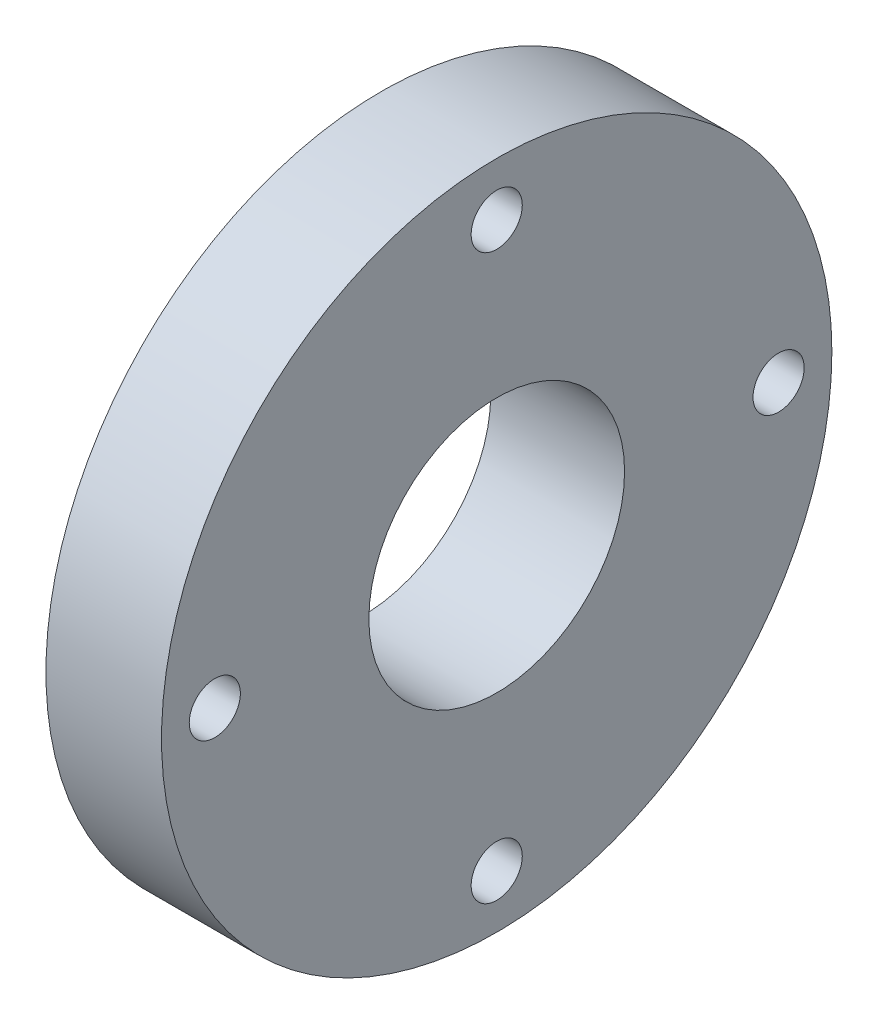
ISO-10303-21;
HEADER;
FILE_DESCRIPTION(('STEP AP214'),'2;1');
FILE_NAME('part.step','',(''),(''),'','','');
FILE_SCHEMA(('AUTOMOTIVE_DESIGN { 1 0 10303 214 1 1 1 1 }'));
ENDSEC;
DATA;
#1=APPLICATION_CONTEXT('core data for automotive mechanical design processes');
#2=APPLICATION_PROTOCOL_DEFINITION('international standard','automotive_design',2000,#1);
#3=PRODUCT_CONTEXT('',#1,'mechanical');
#4=PRODUCT('Part','Part','',(#3));
#5=PRODUCT_RELATED_PRODUCT_CATEGORY('part','',(#4));
#6=PRODUCT_DEFINITION_FORMATION('','',#4);
#7=PRODUCT_DEFINITION_CONTEXT('part definition',#1,'design');
#8=PRODUCT_DEFINITION('design','',#6,#7);
#9=PRODUCT_DEFINITION_SHAPE('','',#8);
#10=(LENGTH_UNIT() NAMED_UNIT(*) SI_UNIT(.MILLI.,.METRE.));
#11=(NAMED_UNIT(*) PLANE_ANGLE_UNIT() SI_UNIT($,.RADIAN.));
#12=(NAMED_UNIT(*) SI_UNIT($,.STERADIAN.) SOLID_ANGLE_UNIT());
#13=UNCERTAINTY_MEASURE_WITH_UNIT(LENGTH_MEASURE(1.E-05),#10,'distance_accuracy_value','');
#14=(GEOMETRIC_REPRESENTATION_CONTEXT(3) GLOBAL_UNCERTAINTY_ASSIGNED_CONTEXT((#13)) GLOBAL_UNIT_ASSIGNED_CONTEXT((#10,
#11,#12)) REPRESENTATION_CONTEXT('',''));
#15=CARTESIAN_POINT('',(0.,0.,0.));
#16=DIRECTION('',(0.,0.,1.));
#17=DIRECTION('',(1.,0.,0.));
#18=AXIS2_PLACEMENT_3D('',#15,#16,#17);
#19=CARTESIAN_POINT('',(-11.303,0.,0.));
#20=DIRECTION('',(1.,0.,0.));
#21=DIRECTION('',(0.,0.,-1.));
#22=AXIS2_PLACEMENT_3D('',#19,#20,#21);
#23=PLANE('',#22);
#24=CARTESIAN_POINT('',(-11.303,27.559,0.));
#25=DIRECTION('',(-1.,0.,0.));
#26=DIRECTION('',(0.,0.,1.));
#27=AXIS2_PLACEMENT_3D('',#24,#25,#26);
#28=CIRCLE('',#27,2.49999999999999);
#29=CARTESIAN_POINT('',(-11.303,27.559,2.49999999999999));
#30=VERTEX_POINT('',#29);
#31=EDGE_CURVE('E135',#30,#30,#28,.T.);
#32=ORIENTED_EDGE('',*,*,#31,.F.);
#33=EDGE_LOOP('',(#32));
#34=FACE_BOUND('',#33,.T.);
#35=CARTESIAN_POINT('',(-11.303,0.,27.559));
#36=DIRECTION('',(-1.,0.,0.));
#37=DIRECTION('',(0.,0.,1.));
#38=AXIS2_PLACEMENT_3D('',#35,#36,#37);
#39=CIRCLE('',#38,2.49999999999999);
#40=CARTESIAN_POINT('',(-11.303,0.,30.059));
#41=VERTEX_POINT('',#40);
#42=EDGE_CURVE('E67',#41,#41,#39,.T.);
#43=ORIENTED_EDGE('',*,*,#42,.F.);
#44=EDGE_LOOP('',(#43));
#45=FACE_BOUND('',#44,.T.);
#46=CARTESIAN_POINT('',(-11.303,-27.559,0.));
#47=DIRECTION('',(-1.,0.,0.));
#48=DIRECTION('',(0.,0.,1.));
#49=AXIS2_PLACEMENT_3D('',#46,#47,#48);
#50=CIRCLE('',#49,2.49999999999999);
#51=CARTESIAN_POINT('',(-11.303,-27.559,2.49999999999999));
#52=VERTEX_POINT('',#51);
#53=EDGE_CURVE('E57',#52,#52,#50,.T.);
#54=ORIENTED_EDGE('',*,*,#53,.F.);
#55=EDGE_LOOP('',(#54));
#56=FACE_BOUND('',#55,.T.);
#57=CARTESIAN_POINT('',(-11.303,0.,-27.559));
#58=DIRECTION('',(-1.,0.,0.));
#59=DIRECTION('',(0.,0.,1.));
#60=AXIS2_PLACEMENT_3D('',#57,#58,#59);
#61=CIRCLE('',#60,2.49999999999999);
#62=CARTESIAN_POINT('',(-11.303,0.,-25.059));
#63=VERTEX_POINT('',#62);
#64=EDGE_CURVE('E54',#63,#63,#61,.T.);
#65=ORIENTED_EDGE('',*,*,#64,.F.);
#66=EDGE_LOOP('',(#65));
#67=FACE_BOUND('',#66,.T.);
#68=CARTESIAN_POINT('',(-11.303,0.,0.));
#69=DIRECTION('',(1.,0.,0.));
#70=DIRECTION('',(0.,0.,-1.));
#71=AXIS2_PLACEMENT_3D('',#68,#69,#70);
#72=CIRCLE('',#71,32.766);
#73=CARTESIAN_POINT('',(-11.303,0.,-32.766));
#74=VERTEX_POINT('',#73);
#75=EDGE_CURVE('E42',#74,#74,#72,.T.);
#76=ORIENTED_EDGE('',*,*,#75,.F.);
#77=EDGE_LOOP('',(#76));
#78=FACE_BOUND('',#77,.T.);
#79=CARTESIAN_POINT('',(-11.303,0.,0.));
#80=DIRECTION('',(1.,0.,0.));
#81=DIRECTION('',(0.,0.,-1.));
#82=AXIS2_PLACEMENT_3D('',#79,#80,#81);
#83=CIRCLE('',#82,22.479);
#84=CARTESIAN_POINT('',(-11.303,0.,-22.479));
#85=VERTEX_POINT('',#84);
#86=EDGE_CURVE('E10',#85,#85,#83,.F.);
#87=ORIENTED_EDGE('',*,*,#86,.F.);
#88=EDGE_LOOP('',(#87));
#89=FACE_BOUND('',#88,.T.);
#90=ADVANCED_FACE('F34',(#34,#45,#56,#67,#78,#89),#23,.F.);
#91=CARTESIAN_POINT('',(-11.303,0.,0.));
#92=DIRECTION('',(1.,0.,0.));
#93=DIRECTION('',(0.,0.,-1.));
#94=AXIS2_PLACEMENT_3D('',#91,#92,#93);
#95=CYLINDRICAL_SURFACE('',#94,32.766);
#96=CARTESIAN_POINT('',(0.,0.,0.));
#97=DIRECTION('',(1.,0.,0.));
#98=DIRECTION('',(0.,0.,-1.));
#99=AXIS2_PLACEMENT_3D('',#96,#97,#98);
#100=CIRCLE('',#99,32.766);
#101=CARTESIAN_POINT('',(0.,0.,-32.766));
#102=VERTEX_POINT('',#101);
#103=EDGE_CURVE('E47',#102,#102,#100,.T.);
#104=CARTESIAN_POINT('',(-11.303,0.,-32.766));
#105=CARTESIAN_POINT('',(-11.1852604166667,0.,-32.766));
#106=CARTESIAN_POINT('',(-11.0675208333333,0.,-32.766));
#107=CARTESIAN_POINT('',(-10.8320416666667,0.,-32.766));
#108=CARTESIAN_POINT('',(-10.7143020833333,0.,-32.766));
#109=CARTESIAN_POINT('',(-10.4788229166667,0.,-32.766));
#110=CARTESIAN_POINT('',(-10.3610833333333,0.,-32.766));
#111=CARTESIAN_POINT('',(-10.1256041666667,0.,-32.766));
#112=CARTESIAN_POINT('',(-10.0078645833333,0.,-32.766));
#113=CARTESIAN_POINT('',(-9.77238541666667,0.,-32.766));
#114=CARTESIAN_POINT('',(-9.65464583333334,0.,-32.766));
#115=CARTESIAN_POINT('',(-9.41916666666667,0.,-32.766));
#116=CARTESIAN_POINT('',(-9.30142708333334,0.,-32.766));
#117=CARTESIAN_POINT('',(-9.06594791666667,0.,-32.766));
#118=CARTESIAN_POINT('',(-8.94820833333334,0.,-32.766));
#119=CARTESIAN_POINT('',(-8.71272916666667,0.,-32.766));
#120=CARTESIAN_POINT('',(-8.59498958333334,0.,-32.766));
#121=CARTESIAN_POINT('',(-8.35951041666667,0.,-32.766));
#122=CARTESIAN_POINT('',(-8.24177083333334,0.,-32.766));
#123=CARTESIAN_POINT('',(-8.00629166666667,0.,-32.766));
#124=CARTESIAN_POINT('',(-7.88855208333333,0.,-32.766));
#125=CARTESIAN_POINT('',(-7.65307291666667,0.,-32.766));
#126=CARTESIAN_POINT('',(-7.53533333333333,0.,-32.766));
#127=CARTESIAN_POINT('',(-7.29985416666667,0.,-32.766));
#128=CARTESIAN_POINT('',(-7.18211458333334,0.,-32.766));
#129=CARTESIAN_POINT('',(-6.94663541666667,0.,-32.766));
#130=CARTESIAN_POINT('',(-6.82889583333333,0.,-32.766));
#131=CARTESIAN_POINT('',(-6.59341666666667,0.,-32.766));
#132=CARTESIAN_POINT('',(-6.47567708333334,0.,-32.766));
#133=CARTESIAN_POINT('',(-6.24019791666667,0.,-32.766));
#134=CARTESIAN_POINT('',(-6.12245833333334,0.,-32.766));
#135=CARTESIAN_POINT('',(-5.88697916666667,0.,-32.766));
#136=CARTESIAN_POINT('',(-5.76923958333334,0.,-32.766));
#137=CARTESIAN_POINT('',(-5.53376041666667,0.,-32.766));
#138=CARTESIAN_POINT('',(-5.41602083333334,0.,-32.766));
#139=CARTESIAN_POINT('',(-5.18054166666667,0.,-32.766));
#140=CARTESIAN_POINT('',(-5.06280208333334,0.,-32.766));
#141=CARTESIAN_POINT('',(-4.82732291666667,0.,-32.766));
#142=CARTESIAN_POINT('',(-4.70958333333334,0.,-32.766));
#143=CARTESIAN_POINT('',(-4.47410416666667,0.,-32.766));
#144=CARTESIAN_POINT('',(-4.35636458333334,0.,-32.766));
#145=CARTESIAN_POINT('',(-4.12088541666667,0.,-32.766));
#146=CARTESIAN_POINT('',(-4.00314583333333,0.,-32.766));
#147=CARTESIAN_POINT('',(-3.76766666666667,0.,-32.766));
#148=CARTESIAN_POINT('',(-3.64992708333334,0.,-32.766));
#149=CARTESIAN_POINT('',(-3.41444791666667,0.,-32.766));
#150=CARTESIAN_POINT('',(-3.29670833333334,0.,-32.766));
#151=CARTESIAN_POINT('',(-3.06122916666667,0.,-32.766));
#152=CARTESIAN_POINT('',(-2.94348958333334,0.,-32.766));
#153=CARTESIAN_POINT('',(-2.70801041666667,0.,-32.766));
#154=CARTESIAN_POINT('',(-2.59027083333334,0.,-32.766));
#155=CARTESIAN_POINT('',(-2.35479166666667,0.,-32.766));
#156=CARTESIAN_POINT('',(-2.23705208333333,0.,-32.766));
#157=CARTESIAN_POINT('',(-2.00157291666667,0.,-32.766));
#158=CARTESIAN_POINT('',(-1.88383333333333,0.,-32.766));
#159=CARTESIAN_POINT('',(-1.64835416666667,0.,-32.766));
#160=CARTESIAN_POINT('',(-1.53061458333334,0.,-32.766));
#161=CARTESIAN_POINT('',(-1.29513541666667,0.,-32.766));
#162=CARTESIAN_POINT('',(-1.17739583333334,0.,-32.766));
#163=CARTESIAN_POINT('',(-0.941916666666669,0.,-32.766));
#164=CARTESIAN_POINT('',(-0.824177083333336,0.,-32.766));
#165=CARTESIAN_POINT('',(-0.588697916666669,0.,-32.766));
#166=CARTESIAN_POINT('',(-0.470958333333335,0.,-32.766));
#167=CARTESIAN_POINT('',(-0.235479166666669,0.,-32.766));
#168=CARTESIAN_POINT('',(-0.117739583333335,0.,-32.766));
#169=CARTESIAN_POINT('',(0.,0.,-32.766));
#170=B_SPLINE_CURVE_WITH_KNOTS('',3,(#104,#105,#106,#107,#108,#109,#110,#111,#112,#113,#114,
#115,#116,#117,#118,#119,#120,#121,#122,#123,#124,#125,#126,#127,#128,#129,#130,#131,#132,#133,
#134,#135,#136,#137,#138,#139,#140,#141,#142,#143,#144,#145,#146,#147,#148,#149,#150,#151,#152,
#153,#154,#155,#156,#157,#158,#159,#160,#161,#162,#163,#164,#165,#166,#167,#168,#169),
.UNSPECIFIED.,.F.,.F.,(4,2,2,2,2,2,2,2,2,2,2,2,2,2,2,2,2,2,2,2,2,2,2,2,2,2,2,2,2,2,2,2,4),(0.,
0.353218749999998,0.706437499999999,1.05965625,1.412875,1.76609375,2.1193125,2.47253125,2.82575,
3.17896875,3.5321875,3.88540625,4.238625,4.59184375,4.9450625,5.29828125,5.6515,6.00471875,
6.3579375,6.71115625,7.064375,7.41759375,7.7708125,8.12403125,8.47725,8.83046875,9.1836875,
9.53690625,9.890125,10.24334375,10.5965625,10.94978125,11.303),.UNSPECIFIED.);
#171=EDGE_CURVE('BSEAM36',#74,#102,#170,.T.);
#172=ORIENTED_EDGE('',*,*,#75,.T.);
#173=ORIENTED_EDGE('',*,*,#103,.F.);
#174=ORIENTED_EDGE('',*,*,#171,.T.);
#175=ORIENTED_EDGE('',*,*,#171,.F.);
#176=EDGE_LOOP('',(#172,#174,#173,#175));
#177=FACE_BOUND('',#176,.T.);
#178=ADVANCED_FACE('F36',(#177),#95,.T.);
#179=CARTESIAN_POINT('',(0.,0.,0.));
#180=DIRECTION('',(1.,0.,0.));
#181=DIRECTION('',(0.,0.,-1.));
#182=AXIS2_PLACEMENT_3D('',#179,#180,#181);
#183=PLANE('',#182);
#184=CARTESIAN_POINT('',(0.,27.559,0.));
#185=DIRECTION('',(1.,0.,0.));
#186=DIRECTION('',(0.,0.,-1.));
#187=AXIS2_PLACEMENT_3D('',#184,#185,#186);
#188=CIRCLE('',#187,2.49999999999999);
#189=CARTESIAN_POINT('',(0.,27.559,-2.49999999999999));
#190=VERTEX_POINT('',#189);
#191=EDGE_CURVE('E133',#190,#190,#188,.T.);
#192=ORIENTED_EDGE('',*,*,#191,.F.);
#193=EDGE_LOOP('',(#192));
#194=FACE_BOUND('',#193,.T.);
#195=CARTESIAN_POINT('',(0.,0.,27.559));
#196=DIRECTION('',(1.,0.,0.));
#197=DIRECTION('',(0.,0.,-1.));
#198=AXIS2_PLACEMENT_3D('',#195,#196,#197);
#199=CIRCLE('',#198,2.49999999999999);
#200=CARTESIAN_POINT('',(0.,0.,25.059));
#201=VERTEX_POINT('',#200);
#202=EDGE_CURVE('E38',#201,#201,#199,.T.);
#203=ORIENTED_EDGE('',*,*,#202,.F.);
#204=EDGE_LOOP('',(#203));
#205=FACE_BOUND('',#204,.T.);
#206=CARTESIAN_POINT('',(0.,-27.559,0.));
#207=DIRECTION('',(1.,0.,0.));
#208=DIRECTION('',(0.,0.,-1.));
#209=AXIS2_PLACEMENT_3D('',#206,#207,#208);
#210=CIRCLE('',#209,2.49999999999999);
#211=CARTESIAN_POINT('',(0.,-27.559,-2.49999999999999));
#212=VERTEX_POINT('',#211);
#213=EDGE_CURVE('E55',#212,#212,#210,.T.);
#214=ORIENTED_EDGE('',*,*,#213,.F.);
#215=EDGE_LOOP('',(#214));
#216=FACE_BOUND('',#215,.T.);
#217=CARTESIAN_POINT('',(0.,0.,-27.559));
#218=DIRECTION('',(1.,0.,0.));
#219=DIRECTION('',(0.,0.,-1.));
#220=AXIS2_PLACEMENT_3D('',#217,#218,#219);
#221=CIRCLE('',#220,2.49999999999999);
#222=CARTESIAN_POINT('',(0.,0.,-30.059));
#223=VERTEX_POINT('',#222);
#224=EDGE_CURVE('E51',#223,#223,#221,.T.);
#225=ORIENTED_EDGE('',*,*,#224,.F.);
#226=EDGE_LOOP('',(#225));
#227=FACE_BOUND('',#226,.T.);
#228=CARTESIAN_POINT('',(0.,0.,0.));
#229=DIRECTION('',(-1.,0.,0.));
#230=DIRECTION('',(0.,0.,1.));
#231=AXIS2_PLACEMENT_3D('',#228,#229,#230);
#232=CIRCLE('',#231,12.5);
#233=CARTESIAN_POINT('',(0.,0.,12.5));
#234=VERTEX_POINT('',#233);
#235=EDGE_CURVE('E71',#234,#234,#232,.T.);
#236=ORIENTED_EDGE('',*,*,#235,.T.);
#237=EDGE_LOOP('',(#236));
#238=FACE_BOUND('',#237,.T.);
#239=ORIENTED_EDGE('',*,*,#103,.T.);
#240=EDGE_LOOP('',(#239));
#241=FACE_BOUND('',#240,.T.);
#242=ADVANCED_FACE('F83',(#194,#205,#216,#227,#238,#241),#183,.T.);
#243=CARTESIAN_POINT('',(-13.081,0.,0.));
#244=DIRECTION('',(1.,0.,0.));
#245=DIRECTION('',(0.,0.,-1.));
#246=AXIS2_PLACEMENT_3D('',#243,#244,#245);
#247=CYLINDRICAL_SURFACE('',#246,22.479);
#248=CARTESIAN_POINT('',(-13.081,0.,0.));
#249=DIRECTION('',(-1.,0.,0.));
#250=DIRECTION('',(0.,0.,1.));
#251=AXIS2_PLACEMENT_3D('',#248,#249,#250);
#252=CIRCLE('',#251,22.479);
#253=CARTESIAN_POINT('',(-13.081,0.,22.479));
#254=VERTEX_POINT('',#253);
#255=EDGE_CURVE('E74',#254,#254,#252,.T.);
#256=ORIENTED_EDGE('',*,*,#255,.F.);
#257=EDGE_LOOP('',(#256));
#258=FACE_BOUND('',#257,.T.);
#259=ORIENTED_EDGE('',*,*,#86,.T.);
#260=EDGE_LOOP('',(#259));
#261=FACE_BOUND('',#260,.T.);
#262=ADVANCED_FACE('F91',(#258,#261),#247,.T.);
#263=CARTESIAN_POINT('',(-13.081,0.,0.));
#264=DIRECTION('',(-1.,0.,0.));
#265=DIRECTION('',(0.,0.,1.));
#266=AXIS2_PLACEMENT_3D('',#263,#264,#265);
#267=PLANE('',#266);
#268=CARTESIAN_POINT('',(-13.081,0.,0.));
#269=DIRECTION('',(-1.,0.,0.));
#270=DIRECTION('',(0.,0.,1.));
#271=AXIS2_PLACEMENT_3D('',#268,#269,#270);
#272=CIRCLE('',#271,12.5);
#273=CARTESIAN_POINT('',(-13.081,0.,12.5));
#274=VERTEX_POINT('',#273);
#275=EDGE_CURVE('E53',#274,#274,#272,.T.);
#276=ORIENTED_EDGE('',*,*,#275,.F.);
#277=EDGE_LOOP('',(#276));
#278=FACE_BOUND('',#277,.T.);
#279=ORIENTED_EDGE('',*,*,#255,.T.);
#280=EDGE_LOOP('',(#279));
#281=FACE_BOUND('',#280,.T.);
#282=ADVANCED_FACE('F105',(#278,#281),#267,.T.);
#283=CARTESIAN_POINT('',(0.,0.,0.));
#284=DIRECTION('',(-1.,0.,0.));
#285=DIRECTION('',(0.,0.,1.));
#286=AXIS2_PLACEMENT_3D('',#283,#284,#285);
#287=CYLINDRICAL_SURFACE('',#286,12.5);
#288=ORIENTED_EDGE('',*,*,#235,.F.);
#289=EDGE_LOOP('',(#288));
#290=FACE_BOUND('',#289,.T.);
#291=ORIENTED_EDGE('',*,*,#275,.T.);
#292=EDGE_LOOP('',(#291));
#293=FACE_BOUND('',#292,.T.);
#294=ADVANCED_FACE('F109',(#290,#293),#287,.F.);
#295=CARTESIAN_POINT('',(-11.303,0.,-27.559));
#296=DIRECTION('',(-1.,0.,0.));
#297=DIRECTION('',(0.,0.,1.));
#298=AXIS2_PLACEMENT_3D('',#295,#296,#297);
#299=CYLINDRICAL_SURFACE('',#298,2.49999999999999);
#300=ORIENTED_EDGE('',*,*,#224,.T.);
#301=EDGE_LOOP('',(#300));
#302=FACE_BOUND('',#301,.T.);
#303=ORIENTED_EDGE('',*,*,#64,.T.);
#304=EDGE_LOOP('',(#303));
#305=FACE_BOUND('',#304,.T.);
#306=ADVANCED_FACE('F113',(#302,#305),#299,.F.);
#307=CARTESIAN_POINT('',(-11.303,-27.559,0.));
#308=DIRECTION('',(-1.,0.,0.));
#309=DIRECTION('',(0.,0.,1.));
#310=AXIS2_PLACEMENT_3D('',#307,#308,#309);
#311=CYLINDRICAL_SURFACE('',#310,2.49999999999999);
#312=ORIENTED_EDGE('',*,*,#213,.T.);
#313=EDGE_LOOP('',(#312));
#314=FACE_BOUND('',#313,.T.);
#315=ORIENTED_EDGE('',*,*,#53,.T.);
#316=EDGE_LOOP('',(#315));
#317=FACE_BOUND('',#316,.T.);
#318=ADVANCED_FACE('F117',(#314,#317),#311,.F.);
#319=CARTESIAN_POINT('',(-11.303,0.,27.559));
#320=DIRECTION('',(-1.,0.,0.));
#321=DIRECTION('',(0.,0.,1.));
#322=AXIS2_PLACEMENT_3D('',#319,#320,#321);
#323=CYLINDRICAL_SURFACE('',#322,2.49999999999999);
#324=ORIENTED_EDGE('',*,*,#202,.T.);
#325=EDGE_LOOP('',(#324));
#326=FACE_BOUND('',#325,.T.);
#327=ORIENTED_EDGE('',*,*,#42,.T.);
#328=EDGE_LOOP('',(#327));
#329=FACE_BOUND('',#328,.T.);
#330=ADVANCED_FACE('F121',(#326,#329),#323,.F.);
#331=CARTESIAN_POINT('',(-11.303,27.559,0.));
#332=DIRECTION('',(-1.,0.,0.));
#333=DIRECTION('',(0.,0.,1.));
#334=AXIS2_PLACEMENT_3D('',#331,#332,#333);
#335=CYLINDRICAL_SURFACE('',#334,2.49999999999999);
#336=ORIENTED_EDGE('',*,*,#191,.T.);
#337=EDGE_LOOP('',(#336));
#338=FACE_BOUND('',#337,.T.);
#339=ORIENTED_EDGE('',*,*,#31,.T.);
#340=EDGE_LOOP('',(#339));
#341=FACE_BOUND('',#340,.T.);
#342=ADVANCED_FACE('F124',(#338,#341),#335,.F.);
#343=CLOSED_SHELL('',(#90,#178,#242,#262,#282,#294,#306,#318,#330,#342));
#344=MANIFOLD_SOLID_BREP('B2',#343);
#345=ADVANCED_BREP_SHAPE_REPRESENTATION('',(#18,#344),#14);
#346=SHAPE_DEFINITION_REPRESENTATION(#9,#345);
ENDSEC;
END-ISO-10303-21;
